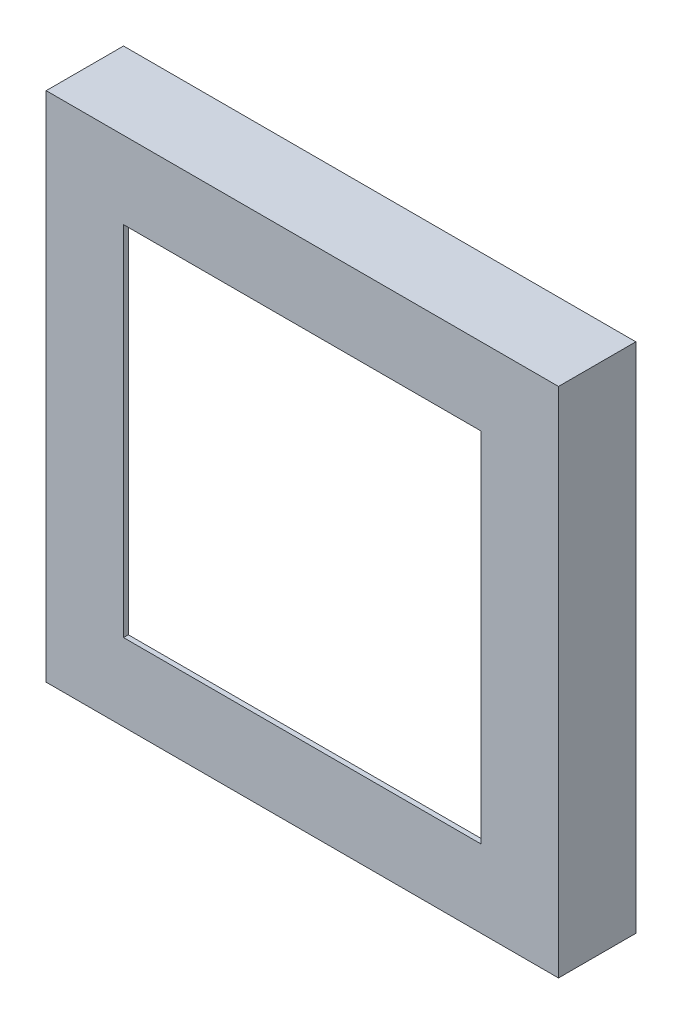
ISO-10303-21;
HEADER;
FILE_DESCRIPTION(('STEP AP214'),'2;1');
FILE_NAME('part.step','',(''),(''),'','','');
FILE_SCHEMA(('AUTOMOTIVE_DESIGN { 1 0 10303 214 1 1 1 1 }'));
ENDSEC;
DATA;
#1=APPLICATION_CONTEXT('core data for automotive mechanical design processes');
#2=APPLICATION_PROTOCOL_DEFINITION('international standard','automotive_design',2000,#1);
#3=PRODUCT_CONTEXT('',#1,'mechanical');
#4=PRODUCT('Part','Part','',(#3));
#5=PRODUCT_RELATED_PRODUCT_CATEGORY('part','',(#4));
#6=PRODUCT_DEFINITION_FORMATION('','',#4);
#7=PRODUCT_DEFINITION_CONTEXT('part definition',#1,'design');
#8=PRODUCT_DEFINITION('design','',#6,#7);
#9=PRODUCT_DEFINITION_SHAPE('','',#8);
#10=(LENGTH_UNIT() NAMED_UNIT(*) SI_UNIT(.MILLI.,.METRE.));
#11=(NAMED_UNIT(*) PLANE_ANGLE_UNIT() SI_UNIT($,.RADIAN.));
#12=(NAMED_UNIT(*) SI_UNIT($,.STERADIAN.) SOLID_ANGLE_UNIT());
#13=UNCERTAINTY_MEASURE_WITH_UNIT(LENGTH_MEASURE(1.E-05),#10,'distance_accuracy_value','');
#14=(GEOMETRIC_REPRESENTATION_CONTEXT(3) GLOBAL_UNCERTAINTY_ASSIGNED_CONTEXT((#13)) GLOBAL_UNIT_ASSIGNED_CONTEXT((#10,
#11,#12)) REPRESENTATION_CONTEXT('',''));
#15=CARTESIAN_POINT('',(0.,0.,0.));
#16=DIRECTION('',(0.,0.,1.));
#17=DIRECTION('',(1.,0.,0.));
#18=AXIS2_PLACEMENT_3D('',#15,#16,#17);
#19=CARTESIAN_POINT('',(0.,0.,0.));
#20=DIRECTION('',(0.,0.,1.));
#21=DIRECTION('',(1.,0.,0.));
#22=AXIS2_PLACEMENT_3D('',#19,#20,#21);
#23=PLANE('',#22);
#24=DIRECTION('',(1.,0.,0.));
#25=VECTOR('',#24,1.);
#26=CARTESIAN_POINT('',(-1.,-1.,0.));
#27=LINE('',#26,#25);
#28=CARTESIAN_POINT('',(-1.,-1.,0.));
#29=VERTEX_POINT('',#28);
#30=CARTESIAN_POINT('',(105.,-1.,0.));
#31=VERTEX_POINT('',#30);
#32=EDGE_CURVE('E241',#29,#31,#27,.T.);
#33=ORIENTED_EDGE('',*,*,#32,.F.);
#34=DIRECTION('',(0.,-1.,0.));
#35=VECTOR('',#34,1.);
#36=CARTESIAN_POINT('',(-1.,-1.,0.));
#37=LINE('',#36,#35);
#38=CARTESIAN_POINT('',(-1.,105.,0.));
#39=VERTEX_POINT('',#38);
#40=EDGE_CURVE('E251',#39,#29,#37,.T.);
#41=ORIENTED_EDGE('',*,*,#40,.F.);
#42=DIRECTION('',(-1.,0.,0.));
#43=VECTOR('',#42,1.);
#44=CARTESIAN_POINT('',(-1.,105.,0.));
#45=LINE('',#44,#43);
#46=CARTESIAN_POINT('',(105.,105.,0.));
#47=VERTEX_POINT('',#46);
#48=EDGE_CURVE('E248',#47,#39,#45,.T.);
#49=ORIENTED_EDGE('',*,*,#48,.F.);
#50=DIRECTION('',(0.,1.,0.));
#51=VECTOR('',#50,1.);
#52=CARTESIAN_POINT('',(105.,-1.,0.));
#53=LINE('',#52,#51);
#54=EDGE_CURVE('E245',#31,#47,#53,.T.);
#55=ORIENTED_EDGE('',*,*,#54,.F.);
#56=EDGE_LOOP('',(#33,#41,#49,#55));
#57=FACE_BOUND('',#56,.T.);
#58=DIRECTION('',(0.,-1.,0.));
#59=VECTOR('',#58,1.);
#60=CARTESIAN_POINT('',(0.,0.,0.));
#61=LINE('',#60,#59);
#62=CARTESIAN_POINT('',(0.,104.,0.));
#63=VERTEX_POINT('',#62);
#64=CARTESIAN_POINT('',(0.,0.,0.));
#65=VERTEX_POINT('',#64);
#66=EDGE_CURVE('E63',#63,#65,#61,.T.);
#67=ORIENTED_EDGE('',*,*,#66,.T.);
#68=DIRECTION('',(1.,0.,0.));
#69=VECTOR('',#68,1.);
#70=CARTESIAN_POINT('',(0.,0.,0.));
#71=LINE('',#70,#69);
#72=CARTESIAN_POINT('',(104.,0.,0.));
#73=VERTEX_POINT('',#72);
#74=EDGE_CURVE('E219',#65,#73,#71,.T.);
#75=ORIENTED_EDGE('',*,*,#74,.T.);
#76=DIRECTION('',(0.,1.,0.));
#77=VECTOR('',#76,1.);
#78=CARTESIAN_POINT('',(104.,0.,0.));
#79=LINE('',#78,#77);
#80=CARTESIAN_POINT('',(104.,104.,0.));
#81=VERTEX_POINT('',#80);
#82=EDGE_CURVE('E223',#73,#81,#79,.T.);
#83=ORIENTED_EDGE('',*,*,#82,.T.);
#84=DIRECTION('',(-1.,0.,0.));
#85=VECTOR('',#84,1.);
#86=CARTESIAN_POINT('',(0.,104.,0.));
#87=LINE('',#86,#85);
#88=EDGE_CURVE('E206',#81,#63,#87,.T.);
#89=ORIENTED_EDGE('',*,*,#88,.T.);
#90=EDGE_LOOP('',(#67,#75,#83,#89));
#91=FACE_BOUND('',#90,.T.);
#92=ADVANCED_FACE('F39',(#57,#91),#23,.F.);
#93=CARTESIAN_POINT('',(-1.,-1.,15.));
#94=DIRECTION('',(0.,1.,0.));
#95=DIRECTION('',(0.,0.,1.));
#96=AXIS2_PLACEMENT_3D('',#93,#94,#95);
#97=PLANE('',#96);
#98=ORIENTED_EDGE('',*,*,#32,.T.);
#99=DIRECTION('',(0.,0.,-1.));
#100=VECTOR('',#99,1.);
#101=CARTESIAN_POINT('',(105.,-1.,15.));
#102=LINE('',#101,#100);
#103=CARTESIAN_POINT('',(105.,-1.,16.));
#104=VERTEX_POINT('',#103);
#105=EDGE_CURVE('E11',#104,#31,#102,.T.);
#106=ORIENTED_EDGE('',*,*,#105,.F.);
#107=DIRECTION('',(1.,0.,0.));
#108=VECTOR('',#107,1.);
#109=CARTESIAN_POINT('',(-1.,-1.,16.));
#110=LINE('',#109,#108);
#111=CARTESIAN_POINT('',(-1.,-1.,16.));
#112=VERTEX_POINT('',#111);
#113=EDGE_CURVE('E189',#112,#104,#110,.T.);
#114=ORIENTED_EDGE('',*,*,#113,.F.);
#115=DIRECTION('',(0.,0.,-1.));
#116=VECTOR('',#115,1.);
#117=CARTESIAN_POINT('',(-1.,-1.,15.));
#118=LINE('',#117,#116);
#119=EDGE_CURVE('E254',#112,#29,#118,.T.);
#120=ORIENTED_EDGE('',*,*,#119,.T.);
#121=EDGE_LOOP('',(#98,#106,#114,#120));
#122=FACE_BOUND('',#121,.T.);
#123=ADVANCED_FACE('F41',(#122),#97,.F.);
#124=CARTESIAN_POINT('',(105.,-1.,15.));
#125=DIRECTION('',(-1.,0.,0.));
#126=DIRECTION('',(0.,-1.,0.));
#127=AXIS2_PLACEMENT_3D('',#124,#125,#126);
#128=PLANE('',#127);
#129=ORIENTED_EDGE('',*,*,#54,.T.);
#130=DIRECTION('',(0.,0.,-1.));
#131=VECTOR('',#130,1.);
#132=CARTESIAN_POINT('',(105.,105.,15.));
#133=LINE('',#132,#131);
#134=CARTESIAN_POINT('',(105.,105.,16.));
#135=VERTEX_POINT('',#134);
#136=EDGE_CURVE('E48',#135,#47,#133,.T.);
#137=ORIENTED_EDGE('',*,*,#136,.F.);
#138=DIRECTION('',(0.,1.,0.));
#139=VECTOR('',#138,1.);
#140=CARTESIAN_POINT('',(105.,105.,16.));
#141=LINE('',#140,#139);
#142=EDGE_CURVE('E193',#104,#135,#141,.T.);
#143=ORIENTED_EDGE('',*,*,#142,.F.);
#144=ORIENTED_EDGE('',*,*,#105,.T.);
#145=EDGE_LOOP('',(#129,#137,#143,#144));
#146=FACE_BOUND('',#145,.T.);
#147=ADVANCED_FACE('F279',(#146),#128,.F.);
#148=CARTESIAN_POINT('',(-1.,105.,15.));
#149=DIRECTION('',(0.,-1.,0.));
#150=DIRECTION('',(0.,0.,-1.));
#151=AXIS2_PLACEMENT_3D('',#148,#149,#150);
#152=PLANE('',#151);
#153=ORIENTED_EDGE('',*,*,#48,.T.);
#154=DIRECTION('',(0.,0.,-1.));
#155=VECTOR('',#154,1.);
#156=CARTESIAN_POINT('',(-1.,105.,15.));
#157=LINE('',#156,#155);
#158=CARTESIAN_POINT('',(-0.999999999999999,105.,16.));
#159=VERTEX_POINT('',#158);
#160=EDGE_CURVE('E258',#159,#39,#157,.T.);
#161=ORIENTED_EDGE('',*,*,#160,.F.);
#162=DIRECTION('',(-1.,0.,0.));
#163=VECTOR('',#162,1.);
#164=CARTESIAN_POINT('',(-0.999999999999999,105.,16.));
#165=LINE('',#164,#163);
#166=EDGE_CURVE('E197',#135,#159,#165,.T.);
#167=ORIENTED_EDGE('',*,*,#166,.F.);
#168=ORIENTED_EDGE('',*,*,#136,.T.);
#169=EDGE_LOOP('',(#153,#161,#167,#168));
#170=FACE_BOUND('',#169,.T.);
#171=ADVANCED_FACE('F266',(#170),#152,.F.);
#172=CARTESIAN_POINT('',(-1.,-1.,15.));
#173=DIRECTION('',(1.,0.,0.));
#174=DIRECTION('',(0.,0.,-1.));
#175=AXIS2_PLACEMENT_3D('',#172,#173,#174);
#176=PLANE('',#175);
#177=ORIENTED_EDGE('',*,*,#40,.T.);
#178=ORIENTED_EDGE('',*,*,#119,.F.);
#179=DIRECTION('',(0.,-1.,0.));
#180=VECTOR('',#179,1.);
#181=CARTESIAN_POINT('',(-0.999999999999999,105.,16.));
#182=LINE('',#181,#180);
#183=EDGE_CURVE('E152',#159,#112,#182,.T.);
#184=ORIENTED_EDGE('',*,*,#183,.F.);
#185=ORIENTED_EDGE('',*,*,#160,.T.);
#186=EDGE_LOOP('',(#177,#178,#184,#185));
#187=FACE_BOUND('',#186,.T.);
#188=ADVANCED_FACE('F274',(#187),#176,.F.);
#189=CARTESIAN_POINT('',(0.,0.,15.));
#190=DIRECTION('',(1.,0.,0.));
#191=DIRECTION('',(0.,1.,0.));
#192=AXIS2_PLACEMENT_3D('',#189,#190,#191);
#193=PLANE('',#192);
#194=ORIENTED_EDGE('',*,*,#66,.F.);
#195=DIRECTION('',(0.,0.,-1.));
#196=VECTOR('',#195,1.);
#197=CARTESIAN_POINT('',(0.,104.,15.));
#198=LINE('',#197,#196);
#199=CARTESIAN_POINT('',(0.,104.,15.));
#200=VERTEX_POINT('',#199);
#201=EDGE_CURVE('E216',#200,#63,#198,.T.);
#202=ORIENTED_EDGE('',*,*,#201,.F.);
#203=DIRECTION('',(0.,-1.,0.));
#204=VECTOR('',#203,1.);
#205=CARTESIAN_POINT('',(0.,0.,15.));
#206=LINE('',#205,#204);
#207=CARTESIAN_POINT('',(0.,0.,15.));
#208=VERTEX_POINT('',#207);
#209=EDGE_CURVE('E201',#200,#208,#206,.T.);
#210=ORIENTED_EDGE('',*,*,#209,.T.);
#211=DIRECTION('',(0.,0.,-1.));
#212=VECTOR('',#211,1.);
#213=CARTESIAN_POINT('',(0.,0.,15.));
#214=LINE('',#213,#212);
#215=EDGE_CURVE('E238',#208,#65,#214,.T.);
#216=ORIENTED_EDGE('',*,*,#215,.T.);
#217=EDGE_LOOP('',(#194,#202,#210,#216));
#218=FACE_BOUND('',#217,.T.);
#219=ADVANCED_FACE('F292',(#218),#193,.T.);
#220=CARTESIAN_POINT('',(0.,0.,15.));
#221=DIRECTION('',(0.,1.,0.));
#222=DIRECTION('',(0.,0.,1.));
#223=AXIS2_PLACEMENT_3D('',#220,#221,#222);
#224=PLANE('',#223);
#225=ORIENTED_EDGE('',*,*,#74,.F.);
#226=ORIENTED_EDGE('',*,*,#215,.F.);
#227=DIRECTION('',(1.,0.,0.));
#228=VECTOR('',#227,1.);
#229=CARTESIAN_POINT('',(0.,0.,15.));
#230=LINE('',#229,#228);
#231=CARTESIAN_POINT('',(104.,0.,15.));
#232=VERTEX_POINT('',#231);
#233=EDGE_CURVE('E205',#208,#232,#230,.T.);
#234=ORIENTED_EDGE('',*,*,#233,.T.);
#235=DIRECTION('',(0.,0.,-1.));
#236=VECTOR('',#235,1.);
#237=CARTESIAN_POINT('',(104.,0.,15.));
#238=LINE('',#237,#236);
#239=EDGE_CURVE('E235',#232,#73,#238,.T.);
#240=ORIENTED_EDGE('',*,*,#239,.T.);
#241=EDGE_LOOP('',(#225,#226,#234,#240));
#242=FACE_BOUND('',#241,.T.);
#243=ADVANCED_FACE('F298',(#242),#224,.T.);
#244=CARTESIAN_POINT('',(104.,0.,15.));
#245=DIRECTION('',(-1.,0.,0.));
#246=DIRECTION('',(0.,-1.,0.));
#247=AXIS2_PLACEMENT_3D('',#244,#245,#246);
#248=PLANE('',#247);
#249=ORIENTED_EDGE('',*,*,#82,.F.);
#250=ORIENTED_EDGE('',*,*,#239,.F.);
#251=DIRECTION('',(0.,1.,0.));
#252=VECTOR('',#251,1.);
#253=CARTESIAN_POINT('',(104.,0.,15.));
#254=LINE('',#253,#252);
#255=CARTESIAN_POINT('',(104.,104.,15.));
#256=VERTEX_POINT('',#255);
#257=EDGE_CURVE('E210',#232,#256,#254,.T.);
#258=ORIENTED_EDGE('',*,*,#257,.T.);
#259=DIRECTION('',(0.,0.,-1.));
#260=VECTOR('',#259,1.);
#261=CARTESIAN_POINT('',(104.,104.,15.));
#262=LINE('',#261,#260);
#263=EDGE_CURVE('E232',#256,#81,#262,.T.);
#264=ORIENTED_EDGE('',*,*,#263,.T.);
#265=EDGE_LOOP('',(#249,#250,#258,#264));
#266=FACE_BOUND('',#265,.T.);
#267=ADVANCED_FACE('F302',(#266),#248,.T.);
#268=CARTESIAN_POINT('',(0.,104.,15.));
#269=DIRECTION('',(0.,-1.,0.));
#270=DIRECTION('',(0.,0.,-1.));
#271=AXIS2_PLACEMENT_3D('',#268,#269,#270);
#272=PLANE('',#271);
#273=ORIENTED_EDGE('',*,*,#88,.F.);
#274=ORIENTED_EDGE('',*,*,#263,.F.);
#275=DIRECTION('',(-1.,0.,0.));
#276=VECTOR('',#275,1.);
#277=CARTESIAN_POINT('',(0.,104.,15.));
#278=LINE('',#277,#276);
#279=EDGE_CURVE('E55',#256,#200,#278,.T.);
#280=ORIENTED_EDGE('',*,*,#279,.T.);
#281=ORIENTED_EDGE('',*,*,#201,.T.);
#282=EDGE_LOOP('',(#273,#274,#280,#281));
#283=FACE_BOUND('',#282,.T.);
#284=ADVANCED_FACE('F307',(#283),#272,.T.);
#285=CARTESIAN_POINT('',(0.,0.,16.));
#286=DIRECTION('',(0.,0.,1.));
#287=DIRECTION('',(1.,0.,0.));
#288=AXIS2_PLACEMENT_3D('',#285,#286,#287);
#289=PLANE('',#288);
#290=ORIENTED_EDGE('',*,*,#183,.T.);
#291=ORIENTED_EDGE('',*,*,#113,.T.);
#292=ORIENTED_EDGE('',*,*,#142,.T.);
#293=ORIENTED_EDGE('',*,*,#166,.T.);
#294=EDGE_LOOP('',(#290,#291,#292,#293));
#295=FACE_BOUND('',#294,.T.);
#296=DIRECTION('',(1.,0.,0.));
#297=VECTOR('',#296,1.);
#298=CARTESIAN_POINT('',(89.,15.,16.));
#299=LINE('',#298,#297);
#300=CARTESIAN_POINT('',(15.,15.,16.));
#301=VERTEX_POINT('',#300);
#302=CARTESIAN_POINT('',(89.,15.,16.));
#303=VERTEX_POINT('',#302);
#304=EDGE_CURVE('E143',#301,#303,#299,.T.);
#305=ORIENTED_EDGE('',*,*,#304,.F.);
#306=DIRECTION('',(0.,-1.,0.));
#307=VECTOR('',#306,1.);
#308=CARTESIAN_POINT('',(15.,15.,16.));
#309=LINE('',#308,#307);
#310=CARTESIAN_POINT('',(15.,89.,16.));
#311=VERTEX_POINT('',#310);
#312=EDGE_CURVE('E132',#311,#301,#309,.T.);
#313=ORIENTED_EDGE('',*,*,#312,.F.);
#314=DIRECTION('',(-1.,0.,0.));
#315=VECTOR('',#314,1.);
#316=CARTESIAN_POINT('',(89.,89.,16.));
#317=LINE('',#316,#315);
#318=CARTESIAN_POINT('',(89.,89.,16.));
#319=VERTEX_POINT('',#318);
#320=EDGE_CURVE('E162',#319,#311,#317,.T.);
#321=ORIENTED_EDGE('',*,*,#320,.F.);
#322=DIRECTION('',(0.,1.,0.));
#323=VECTOR('',#322,1.);
#324=CARTESIAN_POINT('',(89.,15.,16.));
#325=LINE('',#324,#323);
#326=EDGE_CURVE('E158',#303,#319,#325,.T.);
#327=ORIENTED_EDGE('',*,*,#326,.F.);
#328=EDGE_LOOP('',(#305,#313,#321,#327));
#329=FACE_BOUND('',#328,.T.);
#330=ADVANCED_FACE('F156',(#295,#329),#289,.T.);
#331=CARTESIAN_POINT('',(0.,0.,15.));
#332=DIRECTION('',(0.,0.,1.));
#333=DIRECTION('',(1.,0.,0.));
#334=AXIS2_PLACEMENT_3D('',#331,#332,#333);
#335=PLANE('',#334);
#336=ORIENTED_EDGE('',*,*,#233,.F.);
#337=ORIENTED_EDGE('',*,*,#209,.F.);
#338=ORIENTED_EDGE('',*,*,#279,.F.);
#339=ORIENTED_EDGE('',*,*,#257,.F.);
#340=EDGE_LOOP('',(#336,#337,#338,#339));
#341=FACE_BOUND('',#340,.T.);
#342=DIRECTION('',(0.,-1.,0.));
#343=VECTOR('',#342,1.);
#344=CARTESIAN_POINT('',(15.,15.,15.));
#345=LINE('',#344,#343);
#346=CARTESIAN_POINT('',(15.,89.,15.));
#347=VERTEX_POINT('',#346);
#348=CARTESIAN_POINT('',(15.,15.,15.));
#349=VERTEX_POINT('',#348);
#350=EDGE_CURVE('E167',#347,#349,#345,.T.);
#351=ORIENTED_EDGE('',*,*,#350,.T.);
#352=DIRECTION('',(1.,0.,0.));
#353=VECTOR('',#352,1.);
#354=CARTESIAN_POINT('',(89.,15.,15.));
#355=LINE('',#354,#353);
#356=CARTESIAN_POINT('',(89.,15.,15.));
#357=VERTEX_POINT('',#356);
#358=EDGE_CURVE('E150',#349,#357,#355,.T.);
#359=ORIENTED_EDGE('',*,*,#358,.T.);
#360=DIRECTION('',(0.,1.,0.));
#361=VECTOR('',#360,1.);
#362=CARTESIAN_POINT('',(89.,15.,15.));
#363=LINE('',#362,#361);
#364=CARTESIAN_POINT('',(89.,89.,15.));
#365=VERTEX_POINT('',#364);
#366=EDGE_CURVE('E172',#357,#365,#363,.T.);
#367=ORIENTED_EDGE('',*,*,#366,.T.);
#368=DIRECTION('',(-1.,0.,0.));
#369=VECTOR('',#368,1.);
#370=CARTESIAN_POINT('',(89.,89.,15.));
#371=LINE('',#370,#369);
#372=EDGE_CURVE('E144',#365,#347,#371,.T.);
#373=ORIENTED_EDGE('',*,*,#372,.T.);
#374=EDGE_LOOP('',(#351,#359,#367,#373));
#375=FACE_BOUND('',#374,.T.);
#376=ADVANCED_FACE('F314',(#341,#375),#335,.F.);
#377=CARTESIAN_POINT('',(15.,15.,16.));
#378=DIRECTION('',(1.,0.,0.));
#379=DIRECTION('',(0.,1.,0.));
#380=AXIS2_PLACEMENT_3D('',#377,#378,#379);
#381=PLANE('',#380);
#382=ORIENTED_EDGE('',*,*,#350,.F.);
#383=DIRECTION('',(0.,0.,-1.));
#384=VECTOR('',#383,1.);
#385=CARTESIAN_POINT('',(15.,89.,16.));
#386=LINE('',#385,#384);
#387=EDGE_CURVE('E138',#311,#347,#386,.T.);
#388=ORIENTED_EDGE('',*,*,#387,.F.);
#389=ORIENTED_EDGE('',*,*,#312,.T.);
#390=DIRECTION('',(0.,0.,-1.));
#391=VECTOR('',#390,1.);
#392=CARTESIAN_POINT('',(15.,15.,16.));
#393=LINE('',#392,#391);
#394=EDGE_CURVE('E135',#301,#349,#393,.T.);
#395=ORIENTED_EDGE('',*,*,#394,.T.);
#396=EDGE_LOOP('',(#382,#388,#389,#395));
#397=FACE_BOUND('',#396,.T.);
#398=ADVANCED_FACE('F134',(#397),#381,.T.);
#399=CARTESIAN_POINT('',(89.,15.,16.));
#400=DIRECTION('',(0.,1.,0.));
#401=DIRECTION('',(-1.,0.,0.));
#402=AXIS2_PLACEMENT_3D('',#399,#400,#401);
#403=PLANE('',#402);
#404=ORIENTED_EDGE('',*,*,#358,.F.);
#405=ORIENTED_EDGE('',*,*,#394,.F.);
#406=ORIENTED_EDGE('',*,*,#304,.T.);
#407=DIRECTION('',(0.,0.,-1.));
#408=VECTOR('',#407,1.);
#409=CARTESIAN_POINT('',(89.,15.,16.));
#410=LINE('',#409,#408);
#411=EDGE_CURVE('E153',#303,#357,#410,.T.);
#412=ORIENTED_EDGE('',*,*,#411,.T.);
#413=EDGE_LOOP('',(#404,#405,#406,#412));
#414=FACE_BOUND('',#413,.T.);
#415=ADVANCED_FACE('F147',(#414),#403,.T.);
#416=CARTESIAN_POINT('',(89.,15.,16.));
#417=DIRECTION('',(-1.,0.,0.));
#418=DIRECTION('',(0.,0.,1.));
#419=AXIS2_PLACEMENT_3D('',#416,#417,#418);
#420=PLANE('',#419);
#421=ORIENTED_EDGE('',*,*,#366,.F.);
#422=ORIENTED_EDGE('',*,*,#411,.F.);
#423=ORIENTED_EDGE('',*,*,#326,.T.);
#424=DIRECTION('',(0.,0.,-1.));
#425=VECTOR('',#424,1.);
#426=CARTESIAN_POINT('',(89.,89.,16.));
#427=LINE('',#426,#425);
#428=EDGE_CURVE('E181',#319,#365,#427,.T.);
#429=ORIENTED_EDGE('',*,*,#428,.T.);
#430=EDGE_LOOP('',(#421,#422,#423,#429));
#431=FACE_BOUND('',#430,.T.);
#432=ADVANCED_FACE('F323',(#431),#420,.T.);
#433=CARTESIAN_POINT('',(89.,89.,16.));
#434=DIRECTION('',(0.,-1.,0.));
#435=DIRECTION('',(0.,0.,-1.));
#436=AXIS2_PLACEMENT_3D('',#433,#434,#435);
#437=PLANE('',#436);
#438=ORIENTED_EDGE('',*,*,#372,.F.);
#439=ORIENTED_EDGE('',*,*,#428,.F.);
#440=ORIENTED_EDGE('',*,*,#320,.T.);
#441=ORIENTED_EDGE('',*,*,#387,.T.);
#442=EDGE_LOOP('',(#438,#439,#440,#441));
#443=FACE_BOUND('',#442,.T.);
#444=ADVANCED_FACE('F326',(#443),#437,.T.);
#445=CLOSED_SHELL('',(#92,#123,#147,#171,#188,#219,#243,#267,#284,#330,#376,#398,#415,#432,#444));
#446=MANIFOLD_SOLID_BREP('B2',#445);
#447=ADVANCED_BREP_SHAPE_REPRESENTATION('',(#18,#446),#14);
#448=SHAPE_DEFINITION_REPRESENTATION(#9,#447);
ENDSEC;
END-ISO-10303-21;
